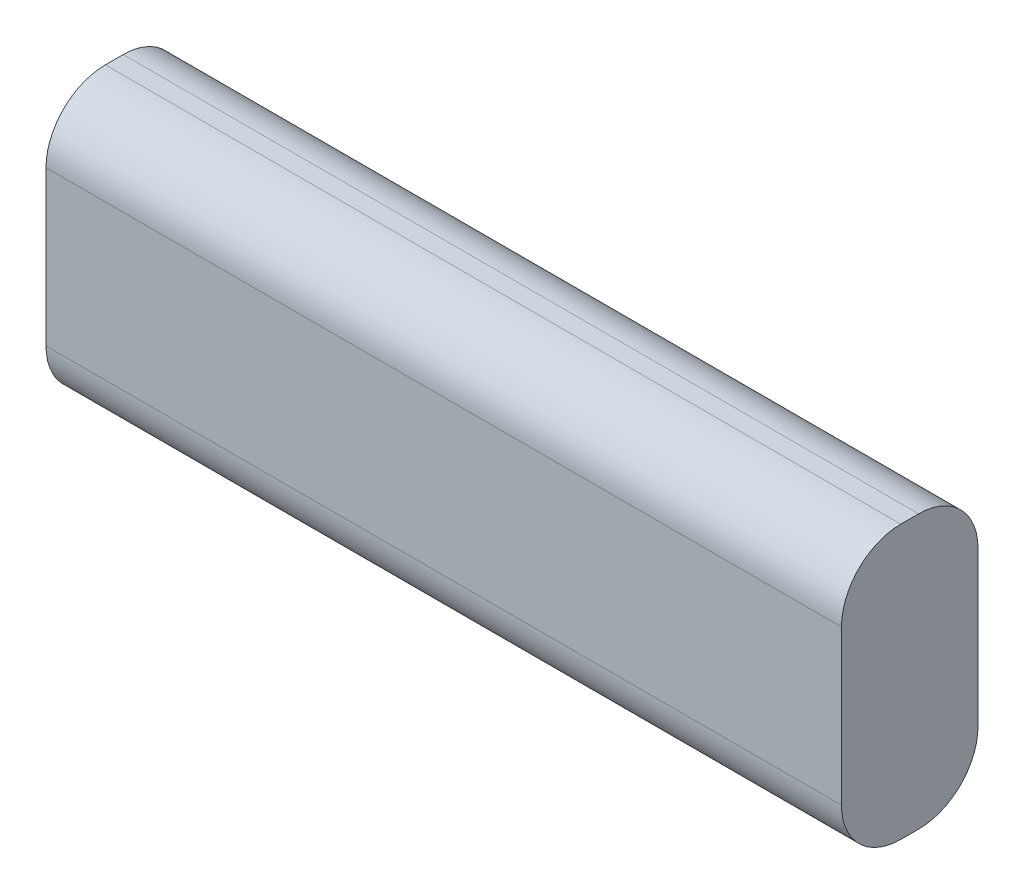
ISO-10303-21;
HEADER;
FILE_DESCRIPTION(('STEP AP214'),'2;1');
FILE_NAME('part.step','',(''),(''),'','','');
FILE_SCHEMA(('AUTOMOTIVE_DESIGN { 1 0 10303 214 1 1 1 1 }'));
ENDSEC;
DATA;
#1=APPLICATION_CONTEXT('core data for automotive mechanical design processes');
#2=APPLICATION_PROTOCOL_DEFINITION('international standard','automotive_design',2000,#1);
#3=PRODUCT_CONTEXT('',#1,'mechanical');
#4=PRODUCT('Part','Part','',(#3));
#5=PRODUCT_RELATED_PRODUCT_CATEGORY('part','',(#4));
#6=PRODUCT_DEFINITION_FORMATION('','',#4);
#7=PRODUCT_DEFINITION_CONTEXT('part definition',#1,'design');
#8=PRODUCT_DEFINITION('design','',#6,#7);
#9=PRODUCT_DEFINITION_SHAPE('','',#8);
#10=(LENGTH_UNIT() NAMED_UNIT(*) SI_UNIT(.MILLI.,.METRE.));
#11=(NAMED_UNIT(*) PLANE_ANGLE_UNIT() SI_UNIT($,.RADIAN.));
#12=(NAMED_UNIT(*) SI_UNIT($,.STERADIAN.) SOLID_ANGLE_UNIT());
#13=UNCERTAINTY_MEASURE_WITH_UNIT(LENGTH_MEASURE(1.E-05),#10,'distance_accuracy_value','');
#14=(GEOMETRIC_REPRESENTATION_CONTEXT(3) GLOBAL_UNCERTAINTY_ASSIGNED_CONTEXT((#13)) GLOBAL_UNIT_ASSIGNED_CONTEXT((#10,
#11,#12)) REPRESENTATION_CONTEXT('',''));
#15=CARTESIAN_POINT('',(0.,0.,0.));
#16=DIRECTION('',(0.,0.,1.));
#17=DIRECTION('',(1.,0.,0.));
#18=AXIS2_PLACEMENT_3D('',#15,#16,#17);
#19=CARTESIAN_POINT('',(0.,0.,23.));
#20=DIRECTION('',(1.,0.,0.));
#21=DIRECTION('',(0.,0.,-1.));
#22=AXIS2_PLACEMENT_3D('',#19,#20,#21);
#23=PLANE('',#22);
#24=DIRECTION('',(0.,0.,-1.));
#25=VECTOR('',#24,1.);
#26=CARTESIAN_POINT('',(0.,46.,23.));
#27=LINE('',#26,#25);
#28=CARTESIAN_POINT('',(0.,46.,13.));
#29=VERTEX_POINT('',#28);
#30=CARTESIAN_POINT('',(0.,46.,10.));
#31=VERTEX_POINT('',#30);
#32=EDGE_CURVE('E105',#29,#31,#27,.T.);
#33=ORIENTED_EDGE('',*,*,#32,.T.);
#34=CARTESIAN_POINT('',(0.,36.,10.));
#35=DIRECTION('',(1.,0.,0.));
#36=DIRECTION('',(0.,0.,-1.));
#37=AXIS2_PLACEMENT_3D('',#34,#35,#36);
#38=CIRCLE('',#37,10.);
#39=CARTESIAN_POINT('',(0.,36.,0.));
#40=VERTEX_POINT('',#39);
#41=EDGE_CURVE('E138',#31,#40,#38,.F.);
#42=ORIENTED_EDGE('',*,*,#41,.T.);
#43=DIRECTION('',(0.,-1.,0.));
#44=VECTOR('',#43,1.);
#45=CARTESIAN_POINT('',(0.,0.,0.));
#46=LINE('',#45,#44);
#47=CARTESIAN_POINT('',(0.,10.,0.));
#48=VERTEX_POINT('',#47);
#49=EDGE_CURVE('E160',#40,#48,#46,.T.);
#50=ORIENTED_EDGE('',*,*,#49,.T.);
#51=CARTESIAN_POINT('',(0.,10.,10.));
#52=DIRECTION('',(1.,0.,0.));
#53=DIRECTION('',(0.,0.,-1.));
#54=AXIS2_PLACEMENT_3D('',#51,#52,#53);
#55=CIRCLE('',#54,10.);
#56=CARTESIAN_POINT('',(0.,0.,10.));
#57=VERTEX_POINT('',#56);
#58=EDGE_CURVE('E136',#48,#57,#55,.F.);
#59=ORIENTED_EDGE('',*,*,#58,.T.);
#60=DIRECTION('',(0.,0.,-1.));
#61=VECTOR('',#60,1.);
#62=CARTESIAN_POINT('',(0.,0.,23.));
#63=LINE('',#62,#61);
#64=CARTESIAN_POINT('',(0.,0.,13.));
#65=VERTEX_POINT('',#64);
#66=EDGE_CURVE('E127',#65,#57,#63,.T.);
#67=ORIENTED_EDGE('',*,*,#66,.F.);
#68=CARTESIAN_POINT('',(0.,10.,13.));
#69=DIRECTION('',(1.,0.,0.));
#70=DIRECTION('',(0.,0.,-1.));
#71=AXIS2_PLACEMENT_3D('',#68,#69,#70);
#72=CIRCLE('',#71,10.);
#73=CARTESIAN_POINT('',(0.,10.,23.));
#74=VERTEX_POINT('',#73);
#75=EDGE_CURVE('E112',#65,#74,#72,.F.);
#76=ORIENTED_EDGE('',*,*,#75,.T.);
#77=DIRECTION('',(0.,-1.,0.));
#78=VECTOR('',#77,1.);
#79=CARTESIAN_POINT('',(0.,0.,23.));
#80=LINE('',#79,#78);
#81=CARTESIAN_POINT('',(0.,36.,23.));
#82=VERTEX_POINT('',#81);
#83=EDGE_CURVE('E107',#82,#74,#80,.T.);
#84=ORIENTED_EDGE('',*,*,#83,.F.);
#85=CARTESIAN_POINT('',(0.,36.,13.));
#86=DIRECTION('',(1.,0.,0.));
#87=DIRECTION('',(0.,0.,-1.));
#88=AXIS2_PLACEMENT_3D('',#85,#86,#87);
#89=CIRCLE('',#88,10.);
#90=EDGE_CURVE('E103',#82,#29,#89,.F.);
#91=ORIENTED_EDGE('',*,*,#90,.T.);
#92=EDGE_LOOP('',(#33,#42,#50,#59,#67,#76,#84,#91));
#93=FACE_BOUND('',#92,.T.);
#94=ADVANCED_FACE('F36',(#93),#23,.F.);
#95=CARTESIAN_POINT('',(0.,0.,23.));
#96=DIRECTION('',(0.,1.,0.));
#97=DIRECTION('',(0.,0.,1.));
#98=AXIS2_PLACEMENT_3D('',#95,#96,#97);
#99=PLANE('',#98);
#100=ORIENTED_EDGE('',*,*,#66,.T.);
#101=DIRECTION('',(1.,0.,0.));
#102=VECTOR('',#101,1.);
#103=CARTESIAN_POINT('',(134.,0.,10.));
#104=LINE('',#103,#102);
#105=CARTESIAN_POINT('',(134.,0.,10.));
#106=VERTEX_POINT('',#105);
#107=EDGE_CURVE('E151',#57,#106,#104,.T.);
#108=ORIENTED_EDGE('',*,*,#107,.T.);
#109=DIRECTION('',(0.,0.,-1.));
#110=VECTOR('',#109,1.);
#111=CARTESIAN_POINT('',(134.,0.,23.));
#112=LINE('',#111,#110);
#113=CARTESIAN_POINT('',(134.,0.,13.));
#114=VERTEX_POINT('',#113);
#115=EDGE_CURVE('E131',#114,#106,#112,.T.);
#116=ORIENTED_EDGE('',*,*,#115,.F.);
#117=DIRECTION('',(1.,0.,0.));
#118=VECTOR('',#117,1.);
#119=CARTESIAN_POINT('',(0.,0.,13.));
#120=LINE('',#119,#118);
#121=EDGE_CURVE('E149',#114,#65,#120,.F.);
#122=ORIENTED_EDGE('',*,*,#121,.T.);
#123=EDGE_LOOP('',(#100,#108,#116,#122));
#124=FACE_BOUND('',#123,.T.);
#125=ADVANCED_FACE('F169',(#124),#99,.F.);
#126=CARTESIAN_POINT('',(134.,0.,23.));
#127=DIRECTION('',(-1.,0.,0.));
#128=DIRECTION('',(0.,0.,1.));
#129=AXIS2_PLACEMENT_3D('',#126,#127,#128);
#130=PLANE('',#129);
#131=DIRECTION('',(0.,1.,0.));
#132=VECTOR('',#131,1.);
#133=CARTESIAN_POINT('',(134.,0.,0.));
#134=LINE('',#133,#132);
#135=CARTESIAN_POINT('',(134.,10.,0.));
#136=VERTEX_POINT('',#135);
#137=CARTESIAN_POINT('',(134.,36.,0.));
#138=VERTEX_POINT('',#137);
#139=EDGE_CURVE('E157',#136,#138,#134,.T.);
#140=ORIENTED_EDGE('',*,*,#139,.T.);
#141=CARTESIAN_POINT('',(134.,36.,10.));
#142=DIRECTION('',(-1.,0.,0.));
#143=DIRECTION('',(0.,0.,1.));
#144=AXIS2_PLACEMENT_3D('',#141,#142,#143);
#145=CIRCLE('',#144,10.);
#146=CARTESIAN_POINT('',(134.,46.,10.));
#147=VERTEX_POINT('',#146);
#148=EDGE_CURVE('E147',#138,#147,#145,.F.);
#149=ORIENTED_EDGE('',*,*,#148,.T.);
#150=DIRECTION('',(0.,0.,-1.));
#151=VECTOR('',#150,1.);
#152=CARTESIAN_POINT('',(134.,46.,23.));
#153=LINE('',#152,#151);
#154=CARTESIAN_POINT('',(134.,46.,13.));
#155=VERTEX_POINT('',#154);
#156=EDGE_CURVE('E122',#155,#147,#153,.T.);
#157=ORIENTED_EDGE('',*,*,#156,.F.);
#158=CARTESIAN_POINT('',(134.,36.,13.));
#159=DIRECTION('',(-1.,0.,0.));
#160=DIRECTION('',(0.,0.,1.));
#161=AXIS2_PLACEMENT_3D('',#158,#159,#160);
#162=CIRCLE('',#161,10.);
#163=CARTESIAN_POINT('',(134.,36.,23.));
#164=VERTEX_POINT('',#163);
#165=EDGE_CURVE('E126',#155,#164,#162,.F.);
#166=ORIENTED_EDGE('',*,*,#165,.T.);
#167=DIRECTION('',(0.,1.,0.));
#168=VECTOR('',#167,1.);
#169=CARTESIAN_POINT('',(134.,0.,23.));
#170=LINE('',#169,#168);
#171=CARTESIAN_POINT('',(134.,10.,23.));
#172=VERTEX_POINT('',#171);
#173=EDGE_CURVE('E123',#172,#164,#170,.T.);
#174=ORIENTED_EDGE('',*,*,#173,.F.);
#175=CARTESIAN_POINT('',(134.,10.,13.));
#176=DIRECTION('',(-1.,0.,0.));
#177=DIRECTION('',(0.,0.,1.));
#178=AXIS2_PLACEMENT_3D('',#175,#176,#177);
#179=CIRCLE('',#178,10.);
#180=EDGE_CURVE('E59',#172,#114,#179,.F.);
#181=ORIENTED_EDGE('',*,*,#180,.T.);
#182=ORIENTED_EDGE('',*,*,#115,.T.);
#183=CARTESIAN_POINT('',(134.,10.,10.));
#184=DIRECTION('',(-1.,0.,0.));
#185=DIRECTION('',(0.,0.,1.));
#186=AXIS2_PLACEMENT_3D('',#183,#184,#185);
#187=CIRCLE('',#186,10.);
#188=EDGE_CURVE('E51',#106,#136,#187,.F.);
#189=ORIENTED_EDGE('',*,*,#188,.T.);
#190=EDGE_LOOP('',(#140,#149,#157,#166,#174,#181,#182,#189));
#191=FACE_BOUND('',#190,.T.);
#192=ADVANCED_FACE('F165',(#191),#130,.F.);
#193=CARTESIAN_POINT('',(0.,46.,23.));
#194=DIRECTION('',(0.,-1.,0.));
#195=DIRECTION('',(0.,0.,-1.));
#196=AXIS2_PLACEMENT_3D('',#193,#194,#195);
#197=PLANE('',#196);
#198=ORIENTED_EDGE('',*,*,#156,.T.);
#199=DIRECTION('',(-1.,0.,0.));
#200=VECTOR('',#199,1.);
#201=CARTESIAN_POINT('',(0.,46.,10.));
#202=LINE('',#201,#200);
#203=EDGE_CURVE('E113',#147,#31,#202,.T.);
#204=ORIENTED_EDGE('',*,*,#203,.T.);
#205=ORIENTED_EDGE('',*,*,#32,.F.);
#206=DIRECTION('',(-1.,0.,0.));
#207=VECTOR('',#206,1.);
#208=CARTESIAN_POINT('',(0.,46.,13.));
#209=LINE('',#208,#207);
#210=EDGE_CURVE('E119',#29,#155,#209,.F.);
#211=ORIENTED_EDGE('',*,*,#210,.T.);
#212=EDGE_LOOP('',(#198,#204,#205,#211));
#213=FACE_BOUND('',#212,.T.);
#214=ADVANCED_FACE('F118',(#213),#197,.F.);
#215=CARTESIAN_POINT('',(0.,0.,23.));
#216=DIRECTION('',(0.,0.,-1.));
#217=DIRECTION('',(-1.,0.,0.));
#218=AXIS2_PLACEMENT_3D('',#215,#216,#217);
#219=PLANE('',#218);
#220=ORIENTED_EDGE('',*,*,#83,.T.);
#221=DIRECTION('',(1.,0.,0.));
#222=VECTOR('',#221,1.);
#223=CARTESIAN_POINT('',(0.,10.,23.));
#224=LINE('',#223,#222);
#225=EDGE_CURVE('E11',#74,#172,#224,.T.);
#226=ORIENTED_EDGE('',*,*,#225,.T.);
#227=ORIENTED_EDGE('',*,*,#173,.T.);
#228=DIRECTION('',(-1.,0.,0.));
#229=VECTOR('',#228,1.);
#230=CARTESIAN_POINT('',(0.,36.,23.));
#231=LINE('',#230,#229);
#232=EDGE_CURVE('E44',#164,#82,#231,.T.);
#233=ORIENTED_EDGE('',*,*,#232,.T.);
#234=EDGE_LOOP('',(#220,#226,#227,#233));
#235=FACE_BOUND('',#234,.T.);
#236=ADVANCED_FACE('F154',(#235),#219,.F.);
#237=CARTESIAN_POINT('',(0.,0.,0.));
#238=DIRECTION('',(0.,0.,-1.));
#239=DIRECTION('',(-1.,0.,0.));
#240=AXIS2_PLACEMENT_3D('',#237,#238,#239);
#241=PLANE('',#240);
#242=ORIENTED_EDGE('',*,*,#49,.F.);
#243=DIRECTION('',(-1.,0.,0.));
#244=VECTOR('',#243,1.);
#245=CARTESIAN_POINT('',(134.,36.,0.));
#246=LINE('',#245,#244);
#247=EDGE_CURVE('E142',#40,#138,#246,.F.);
#248=ORIENTED_EDGE('',*,*,#247,.T.);
#249=ORIENTED_EDGE('',*,*,#139,.F.);
#250=DIRECTION('',(1.,0.,0.));
#251=VECTOR('',#250,1.);
#252=CARTESIAN_POINT('',(0.,10.,0.));
#253=LINE('',#252,#251);
#254=EDGE_CURVE('E140',#136,#48,#253,.F.);
#255=ORIENTED_EDGE('',*,*,#254,.T.);
#256=EDGE_LOOP('',(#242,#248,#249,#255));
#257=FACE_BOUND('',#256,.T.);
#258=ADVANCED_FACE('F178',(#257),#241,.T.);
#259=CARTESIAN_POINT('',(0.,36.,10.));
#260=DIRECTION('',(1.,0.,0.));
#261=DIRECTION('',(0.,0.,-1.));
#262=AXIS2_PLACEMENT_3D('',#259,#260,#261);
#263=CYLINDRICAL_SURFACE('',#262,10.);
#264=ORIENTED_EDGE('',*,*,#148,.F.);
#265=ORIENTED_EDGE('',*,*,#247,.F.);
#266=ORIENTED_EDGE('',*,*,#41,.F.);
#267=ORIENTED_EDGE('',*,*,#203,.F.);
#268=EDGE_LOOP('',(#264,#265,#266,#267));
#269=FACE_BOUND('',#268,.T.);
#270=ADVANCED_FACE('F182',(#269),#263,.T.);
#271=CARTESIAN_POINT('',(0.,10.,10.));
#272=DIRECTION('',(-1.,0.,0.));
#273=DIRECTION('',(0.,0.,1.));
#274=AXIS2_PLACEMENT_3D('',#271,#272,#273);
#275=CYLINDRICAL_SURFACE('',#274,10.);
#276=ORIENTED_EDGE('',*,*,#58,.F.);
#277=ORIENTED_EDGE('',*,*,#254,.F.);
#278=ORIENTED_EDGE('',*,*,#188,.F.);
#279=ORIENTED_EDGE('',*,*,#107,.F.);
#280=EDGE_LOOP('',(#276,#277,#278,#279));
#281=FACE_BOUND('',#280,.T.);
#282=ADVANCED_FACE('F175',(#281),#275,.T.);
#283=CARTESIAN_POINT('',(0.,10.,13.));
#284=DIRECTION('',(1.,0.,0.));
#285=DIRECTION('',(0.,0.,-1.));
#286=AXIS2_PLACEMENT_3D('',#283,#284,#285);
#287=CYLINDRICAL_SURFACE('',#286,10.);
#288=ORIENTED_EDGE('',*,*,#75,.F.);
#289=ORIENTED_EDGE('',*,*,#121,.F.);
#290=ORIENTED_EDGE('',*,*,#180,.F.);
#291=ORIENTED_EDGE('',*,*,#225,.F.);
#292=EDGE_LOOP('',(#288,#289,#290,#291));
#293=FACE_BOUND('',#292,.T.);
#294=ADVANCED_FACE('F173',(#293),#287,.T.);
#295=CARTESIAN_POINT('',(0.,36.,13.));
#296=DIRECTION('',(-1.,0.,0.));
#297=DIRECTION('',(0.,0.,1.));
#298=AXIS2_PLACEMENT_3D('',#295,#296,#297);
#299=CYLINDRICAL_SURFACE('',#298,10.);
#300=ORIENTED_EDGE('',*,*,#165,.F.);
#301=ORIENTED_EDGE('',*,*,#210,.F.);
#302=ORIENTED_EDGE('',*,*,#90,.F.);
#303=ORIENTED_EDGE('',*,*,#232,.F.);
#304=EDGE_LOOP('',(#300,#301,#302,#303));
#305=FACE_BOUND('',#304,.T.);
#306=ADVANCED_FACE('F38',(#305),#299,.T.);
#307=CLOSED_SHELL('',(#94,#125,#192,#214,#236,#258,#270,#282,#294,#306));
#308=MANIFOLD_SOLID_BREP('B2',#307);
#309=ADVANCED_BREP_SHAPE_REPRESENTATION('',(#18,#308),#14);
#310=SHAPE_DEFINITION_REPRESENTATION(#9,#309);
ENDSEC;
END-ISO-10303-21;
